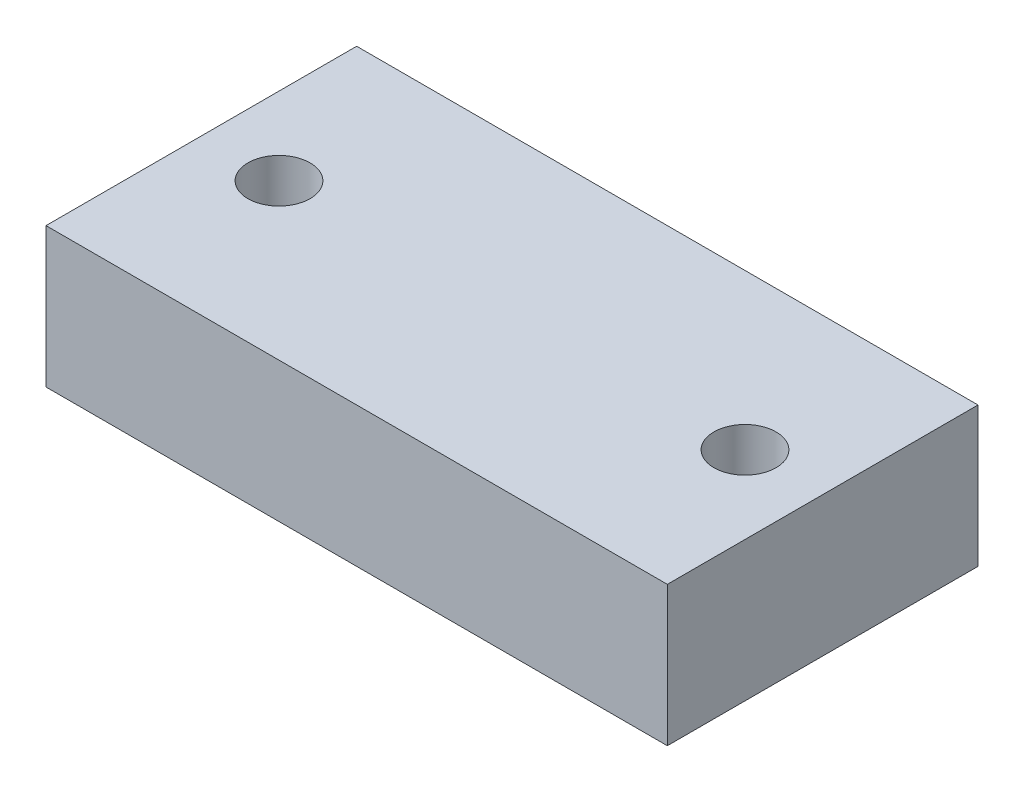
ISO-10303-21;
HEADER;
FILE_DESCRIPTION(('STEP AP214'),'2;1');
FILE_NAME('part.step','',(''),(''),'','','');
FILE_SCHEMA(('AUTOMOTIVE_DESIGN { 1 0 10303 214 1 1 1 1 }'));
ENDSEC;
DATA;
#1=APPLICATION_CONTEXT('core data for automotive mechanical design processes');
#2=APPLICATION_PROTOCOL_DEFINITION('international standard','automotive_design',2000,#1);
#3=PRODUCT_CONTEXT('',#1,'mechanical');
#4=PRODUCT('Part','Part','',(#3));
#5=PRODUCT_RELATED_PRODUCT_CATEGORY('part','',(#4));
#6=PRODUCT_DEFINITION_FORMATION('','',#4);
#7=PRODUCT_DEFINITION_CONTEXT('part definition',#1,'design');
#8=PRODUCT_DEFINITION('design','',#6,#7);
#9=PRODUCT_DEFINITION_SHAPE('','',#8);
#10=(LENGTH_UNIT() NAMED_UNIT(*) SI_UNIT(.MILLI.,.METRE.));
#11=(NAMED_UNIT(*) PLANE_ANGLE_UNIT() SI_UNIT($,.RADIAN.));
#12=(NAMED_UNIT(*) SI_UNIT($,.STERADIAN.) SOLID_ANGLE_UNIT());
#13=UNCERTAINTY_MEASURE_WITH_UNIT(LENGTH_MEASURE(1.E-05),#10,'distance_accuracy_value','');
#14=(GEOMETRIC_REPRESENTATION_CONTEXT(3) GLOBAL_UNCERTAINTY_ASSIGNED_CONTEXT((#13)) GLOBAL_UNIT_ASSIGNED_CONTEXT((#10,
#11,#12)) REPRESENTATION_CONTEXT('',''));
#15=CARTESIAN_POINT('',(0.,0.,0.));
#16=DIRECTION('',(0.,0.,1.));
#17=DIRECTION('',(1.,0.,0.));
#18=AXIS2_PLACEMENT_3D('',#15,#16,#17);
#19=CARTESIAN_POINT('',(0.,18.,0.));
#20=DIRECTION('',(0.,-1.,0.));
#21=DIRECTION('',(0.,0.,-1.));
#22=AXIS2_PLACEMENT_3D('',#19,#20,#21);
#23=PLANE('',#22);
#24=DIRECTION('',(0.,0.,-1.));
#25=VECTOR('',#24,1.);
#26=CARTESIAN_POINT('',(40.,18.,20.));
#27=LINE('',#26,#25);
#28=CARTESIAN_POINT('',(40.,18.,20.));
#29=VERTEX_POINT('',#28);
#30=CARTESIAN_POINT('',(40.,18.,-20.));
#31=VERTEX_POINT('',#30);
#32=EDGE_CURVE('E85',#29,#31,#27,.T.);
#33=ORIENTED_EDGE('',*,*,#32,.T.);
#34=DIRECTION('',(-1.,0.,0.));
#35=VECTOR('',#34,1.);
#36=CARTESIAN_POINT('',(-40.,18.,-20.));
#37=LINE('',#36,#35);
#38=CARTESIAN_POINT('',(-40.,18.,-20.));
#39=VERTEX_POINT('',#38);
#40=EDGE_CURVE('E80',#31,#39,#37,.T.);
#41=ORIENTED_EDGE('',*,*,#40,.T.);
#42=DIRECTION('',(0.,0.,1.));
#43=VECTOR('',#42,1.);
#44=CARTESIAN_POINT('',(-40.,18.,20.));
#45=LINE('',#44,#43);
#46=CARTESIAN_POINT('',(-40.,18.,20.));
#47=VERTEX_POINT('',#46);
#48=EDGE_CURVE('E83',#39,#47,#45,.T.);
#49=ORIENTED_EDGE('',*,*,#48,.T.);
#50=DIRECTION('',(1.,0.,0.));
#51=VECTOR('',#50,1.);
#52=CARTESIAN_POINT('',(-40.,18.,20.));
#53=LINE('',#52,#51);
#54=EDGE_CURVE('E50',#47,#29,#53,.T.);
#55=ORIENTED_EDGE('',*,*,#54,.T.);
#56=EDGE_LOOP('',(#33,#41,#49,#55));
#57=FACE_BOUND('',#56,.T.);
#58=CARTESIAN_POINT('',(30.,18.,0.));
#59=DIRECTION('',(0.,1.,0.));
#60=DIRECTION('',(0.,0.,1.));
#61=AXIS2_PLACEMENT_3D('',#58,#59,#60);
#62=CIRCLE('',#61,4.00000000000001);
#63=CARTESIAN_POINT('',(30.,18.,4.00000000000001));
#64=VERTEX_POINT('',#63);
#65=EDGE_CURVE('E100',#64,#64,#62,.T.);
#66=ORIENTED_EDGE('',*,*,#65,.F.);
#67=EDGE_LOOP('',(#66));
#68=FACE_BOUND('',#67,.T.);
#69=CARTESIAN_POINT('',(-30.,18.,0.));
#70=DIRECTION('',(0.,1.,0.));
#71=DIRECTION('',(0.,0.,1.));
#72=AXIS2_PLACEMENT_3D('',#69,#70,#71);
#73=CIRCLE('',#72,4.00000000000001);
#74=CARTESIAN_POINT('',(-30.,18.,4.00000000000001));
#75=VERTEX_POINT('',#74);
#76=EDGE_CURVE('E115',#75,#75,#73,.T.);
#77=ORIENTED_EDGE('',*,*,#76,.F.);
#78=EDGE_LOOP('',(#77));
#79=FACE_BOUND('',#78,.T.);
#80=ADVANCED_FACE('F33',(#57,#68,#79),#23,.F.);
#81=CARTESIAN_POINT('',(0.,0.,0.));
#82=DIRECTION('',(0.,-1.,0.));
#83=DIRECTION('',(0.,0.,-1.));
#84=AXIS2_PLACEMENT_3D('',#81,#82,#83);
#85=PLANE('',#84);
#86=CARTESIAN_POINT('',(30.,0.,0.));
#87=DIRECTION('',(0.,1.,0.));
#88=DIRECTION('',(0.,0.,1.));
#89=AXIS2_PLACEMENT_3D('',#86,#87,#88);
#90=CIRCLE('',#89,4.00000000000001);
#91=CARTESIAN_POINT('',(30.,0.,4.00000000000001));
#92=VERTEX_POINT('',#91);
#93=EDGE_CURVE('E112',#92,#92,#90,.T.);
#94=ORIENTED_EDGE('',*,*,#93,.T.);
#95=EDGE_LOOP('',(#94));
#96=FACE_BOUND('',#95,.T.);
#97=DIRECTION('',(0.,0.,-1.));
#98=VECTOR('',#97,1.);
#99=CARTESIAN_POINT('',(40.,0.,20.));
#100=LINE('',#99,#98);
#101=CARTESIAN_POINT('',(40.,0.,20.));
#102=VERTEX_POINT('',#101);
#103=CARTESIAN_POINT('',(40.,0.,-20.));
#104=VERTEX_POINT('',#103);
#105=EDGE_CURVE('E97',#102,#104,#100,.T.);
#106=ORIENTED_EDGE('',*,*,#105,.F.);
#107=DIRECTION('',(1.,0.,0.));
#108=VECTOR('',#107,1.);
#109=CARTESIAN_POINT('',(-40.,0.,20.));
#110=LINE('',#109,#108);
#111=CARTESIAN_POINT('',(-40.,0.,20.));
#112=VERTEX_POINT('',#111);
#113=EDGE_CURVE('E73',#112,#102,#110,.T.);
#114=ORIENTED_EDGE('',*,*,#113,.F.);
#115=DIRECTION('',(0.,0.,1.));
#116=VECTOR('',#115,1.);
#117=CARTESIAN_POINT('',(-40.,0.,20.));
#118=LINE('',#117,#116);
#119=CARTESIAN_POINT('',(-40.,0.,-20.));
#120=VERTEX_POINT('',#119);
#121=EDGE_CURVE('E67',#120,#112,#118,.T.);
#122=ORIENTED_EDGE('',*,*,#121,.F.);
#123=DIRECTION('',(-1.,0.,0.));
#124=VECTOR('',#123,1.);
#125=CARTESIAN_POINT('',(-40.,0.,-20.));
#126=LINE('',#125,#124);
#127=EDGE_CURVE('E89',#104,#120,#126,.T.);
#128=ORIENTED_EDGE('',*,*,#127,.F.);
#129=EDGE_LOOP('',(#106,#114,#122,#128));
#130=FACE_BOUND('',#129,.T.);
#131=CARTESIAN_POINT('',(-30.,0.,0.));
#132=DIRECTION('',(0.,1.,0.));
#133=DIRECTION('',(0.,0.,1.));
#134=AXIS2_PLACEMENT_3D('',#131,#132,#133);
#135=CIRCLE('',#134,4.00000000000001);
#136=CARTESIAN_POINT('',(-30.,0.,4.00000000000001));
#137=VERTEX_POINT('',#136);
#138=EDGE_CURVE('E118',#137,#137,#135,.T.);
#139=ORIENTED_EDGE('',*,*,#138,.T.);
#140=EDGE_LOOP('',(#139));
#141=FACE_BOUND('',#140,.T.);
#142=ADVANCED_FACE('F108',(#96,#130,#141),#85,.T.);
#143=CARTESIAN_POINT('',(40.,18.,20.));
#144=DIRECTION('',(-1.,0.,0.));
#145=DIRECTION('',(0.,0.,1.));
#146=AXIS2_PLACEMENT_3D('',#143,#144,#145);
#147=PLANE('',#146);
#148=ORIENTED_EDGE('',*,*,#105,.T.);
#149=DIRECTION('',(0.,-1.,0.));
#150=VECTOR('',#149,1.);
#151=CARTESIAN_POINT('',(40.,18.,-20.));
#152=LINE('',#151,#150);
#153=EDGE_CURVE('E11',#31,#104,#152,.T.);
#154=ORIENTED_EDGE('',*,*,#153,.F.);
#155=ORIENTED_EDGE('',*,*,#32,.F.);
#156=DIRECTION('',(0.,-1.,0.));
#157=VECTOR('',#156,1.);
#158=CARTESIAN_POINT('',(40.,18.,20.));
#159=LINE('',#158,#157);
#160=EDGE_CURVE('E93',#29,#102,#159,.T.);
#161=ORIENTED_EDGE('',*,*,#160,.T.);
#162=EDGE_LOOP('',(#148,#154,#155,#161));
#163=FACE_BOUND('',#162,.T.);
#164=ADVANCED_FACE('F35',(#163),#147,.F.);
#165=CARTESIAN_POINT('',(-40.,18.,-20.));
#166=DIRECTION('',(0.,0.,1.));
#167=DIRECTION('',(1.,0.,0.));
#168=AXIS2_PLACEMENT_3D('',#165,#166,#167);
#169=PLANE('',#168);
#170=ORIENTED_EDGE('',*,*,#127,.T.);
#171=DIRECTION('',(0.,-1.,0.));
#172=VECTOR('',#171,1.);
#173=CARTESIAN_POINT('',(-40.,18.,-20.));
#174=LINE('',#173,#172);
#175=EDGE_CURVE('E42',#39,#120,#174,.T.);
#176=ORIENTED_EDGE('',*,*,#175,.F.);
#177=ORIENTED_EDGE('',*,*,#40,.F.);
#178=ORIENTED_EDGE('',*,*,#153,.T.);
#179=EDGE_LOOP('',(#170,#176,#177,#178));
#180=FACE_BOUND('',#179,.T.);
#181=ADVANCED_FACE('F88',(#180),#169,.F.);
#182=CARTESIAN_POINT('',(-40.,18.,20.));
#183=DIRECTION('',(1.,0.,0.));
#184=DIRECTION('',(0.,0.,-1.));
#185=AXIS2_PLACEMENT_3D('',#182,#183,#184);
#186=PLANE('',#185);
#187=ORIENTED_EDGE('',*,*,#121,.T.);
#188=DIRECTION('',(0.,-1.,0.));
#189=VECTOR('',#188,1.);
#190=CARTESIAN_POINT('',(-40.,18.,20.));
#191=LINE('',#190,#189);
#192=EDGE_CURVE('E90',#47,#112,#191,.T.);
#193=ORIENTED_EDGE('',*,*,#192,.F.);
#194=ORIENTED_EDGE('',*,*,#48,.F.);
#195=ORIENTED_EDGE('',*,*,#175,.T.);
#196=EDGE_LOOP('',(#187,#193,#194,#195));
#197=FACE_BOUND('',#196,.T.);
#198=ADVANCED_FACE('F91',(#197),#186,.F.);
#199=CARTESIAN_POINT('',(-40.,18.,20.));
#200=DIRECTION('',(0.,0.,-1.));
#201=DIRECTION('',(-1.,0.,0.));
#202=AXIS2_PLACEMENT_3D('',#199,#200,#201);
#203=PLANE('',#202);
#204=ORIENTED_EDGE('',*,*,#113,.T.);
#205=ORIENTED_EDGE('',*,*,#160,.F.);
#206=ORIENTED_EDGE('',*,*,#54,.F.);
#207=ORIENTED_EDGE('',*,*,#192,.T.);
#208=EDGE_LOOP('',(#204,#205,#206,#207));
#209=FACE_BOUND('',#208,.T.);
#210=ADVANCED_FACE('F105',(#209),#203,.F.);
#211=CARTESIAN_POINT('',(30.,18.,0.));
#212=DIRECTION('',(0.,-1.,0.));
#213=DIRECTION('',(0.,0.,-1.));
#214=AXIS2_PLACEMENT_3D('',#211,#212,#213);
#215=CYLINDRICAL_SURFACE('',#214,4.00000000000001);
#216=ORIENTED_EDGE('',*,*,#65,.T.);
#217=EDGE_LOOP('',(#216));
#218=FACE_BOUND('',#217,.T.);
#219=ORIENTED_EDGE('',*,*,#93,.F.);
#220=EDGE_LOOP('',(#219));
#221=FACE_BOUND('',#220,.T.);
#222=ADVANCED_FACE('F135',(#218,#221),#215,.F.);
#223=CARTESIAN_POINT('',(-30.,18.,0.));
#224=DIRECTION('',(0.,-1.,0.));
#225=DIRECTION('',(0.,0.,-1.));
#226=AXIS2_PLACEMENT_3D('',#223,#224,#225);
#227=CYLINDRICAL_SURFACE('',#226,4.00000000000001);
#228=ORIENTED_EDGE('',*,*,#76,.T.);
#229=EDGE_LOOP('',(#228));
#230=FACE_BOUND('',#229,.T.);
#231=ORIENTED_EDGE('',*,*,#138,.F.);
#232=EDGE_LOOP('',(#231));
#233=FACE_BOUND('',#232,.T.);
#234=ADVANCED_FACE('F124',(#230,#233),#227,.F.);
#235=CLOSED_SHELL('',(#80,#142,#164,#181,#198,#210,#222,#234));
#236=MANIFOLD_SOLID_BREP('B2',#235);
#237=ADVANCED_BREP_SHAPE_REPRESENTATION('',(#18,#236),#14);
#238=SHAPE_DEFINITION_REPRESENTATION(#9,#237);
ENDSEC;
END-ISO-10303-21;
